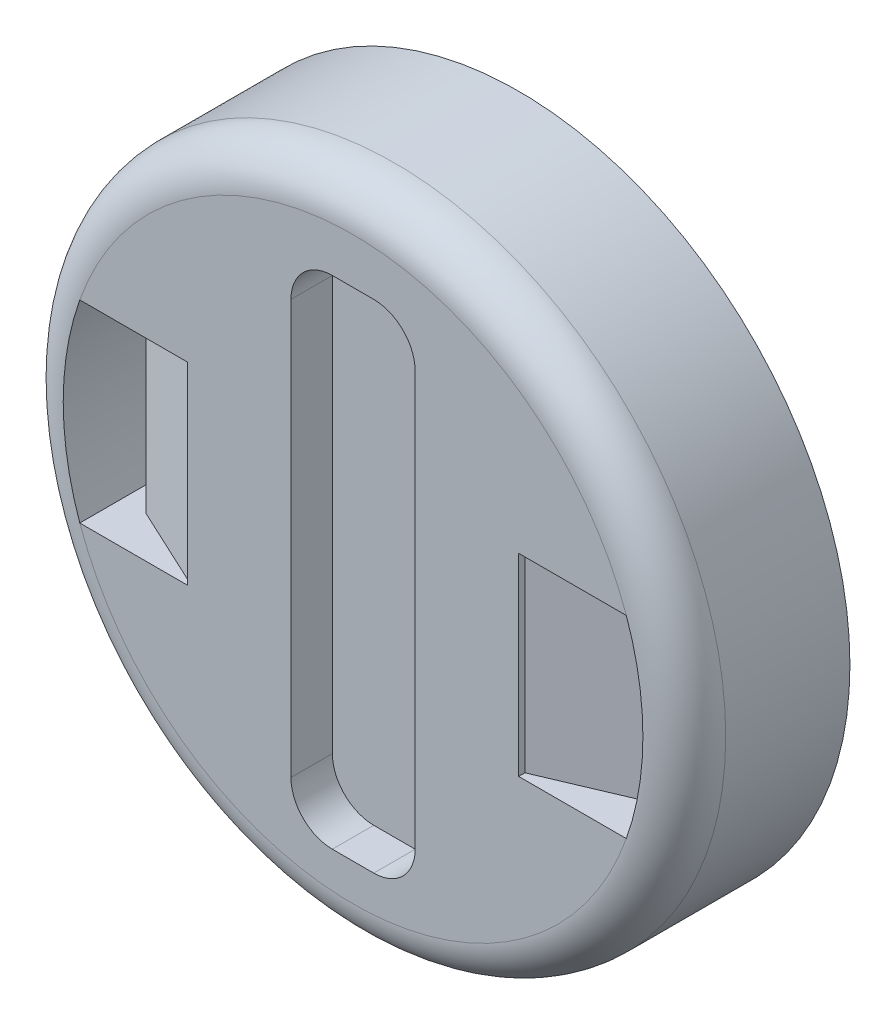
ISO-10303-21;
HEADER;
FILE_DESCRIPTION(('STEP AP214'),'2;1');
FILE_NAME('part.step','',(''),(''),'','','');
FILE_SCHEMA(('AUTOMOTIVE_DESIGN { 1 0 10303 214 1 1 1 1 }'));
ENDSEC;
DATA;
#1=APPLICATION_CONTEXT('core data for automotive mechanical design processes');
#2=APPLICATION_PROTOCOL_DEFINITION('international standard','automotive_design',2000,#1);
#3=PRODUCT_CONTEXT('',#1,'mechanical');
#4=PRODUCT('Part','Part','',(#3));
#5=PRODUCT_RELATED_PRODUCT_CATEGORY('part','',(#4));
#6=PRODUCT_DEFINITION_FORMATION('','',#4);
#7=PRODUCT_DEFINITION_CONTEXT('part definition',#1,'design');
#8=PRODUCT_DEFINITION('design','',#6,#7);
#9=PRODUCT_DEFINITION_SHAPE('','',#8);
#10=(LENGTH_UNIT() NAMED_UNIT(*) SI_UNIT(.MILLI.,.METRE.));
#11=(NAMED_UNIT(*) PLANE_ANGLE_UNIT() SI_UNIT($,.RADIAN.));
#12=(NAMED_UNIT(*) SI_UNIT($,.STERADIAN.) SOLID_ANGLE_UNIT());
#13=UNCERTAINTY_MEASURE_WITH_UNIT(LENGTH_MEASURE(1.E-05),#10,'distance_accuracy_value','');
#14=(GEOMETRIC_REPRESENTATION_CONTEXT(3) GLOBAL_UNCERTAINTY_ASSIGNED_CONTEXT((#13)) GLOBAL_UNIT_ASSIGNED_CONTEXT((#10,
#11,#12)) REPRESENTATION_CONTEXT('',''));
#15=CARTESIAN_POINT('',(0.,0.,0.));
#16=DIRECTION('',(0.,0.,1.));
#17=DIRECTION('',(1.,0.,0.));
#18=AXIS2_PLACEMENT_3D('',#15,#16,#17);
#19=CARTESIAN_POINT('',(4.,2.33333333333333,15.));
#20=DIRECTION('',(0.,1.,0.));
#21=DIRECTION('',(0.,0.,1.));
#22=AXIS2_PLACEMENT_3D('',#19,#20,#21);
#23=PLANE('',#22);
#24=DIRECTION('',(-1.,0.,0.));
#25=VECTOR('',#24,1.);
#26=CARTESIAN_POINT('',(4.,2.33333333333333,14.));
#27=LINE('',#26,#25);
#28=CARTESIAN_POINT('',(6.59966329107444,2.33333333333333,14.));
#29=VERTEX_POINT('',#28);
#30=CARTESIAN_POINT('',(5.99999999999999,2.33333333333333,14.));
#31=VERTEX_POINT('',#30);
#32=EDGE_CURVE('E437',#29,#31,#27,.T.);
#33=ORIENTED_EDGE('',*,*,#32,.F.);
#34=DIRECTION('',(0.,0.,1.));
#35=VECTOR('',#34,1.);
#36=CARTESIAN_POINT('',(6.59966329107444,2.33333333333333,15.));
#37=LINE('',#36,#35);
#38=CARTESIAN_POINT('',(6.59966329107444,2.33333333333333,16.));
#39=VERTEX_POINT('',#38);
#40=EDGE_CURVE('E187',#29,#39,#37,.T.);
#41=ORIENTED_EDGE('',*,*,#40,.T.);
#42=DIRECTION('',(-1.,0.,0.));
#43=VECTOR('',#42,1.);
#44=CARTESIAN_POINT('',(4.,2.33333333333333,16.));
#45=LINE('',#44,#43);
#46=CARTESIAN_POINT('',(4.,2.33333333333333,16.));
#47=VERTEX_POINT('',#46);
#48=EDGE_CURVE('E212',#39,#47,#45,.T.);
#49=ORIENTED_EDGE('',*,*,#48,.T.);
#50=DIRECTION('',(0.,0.,1.));
#51=VECTOR('',#50,1.);
#52=CARTESIAN_POINT('',(4.,2.33333333333333,15.));
#53=LINE('',#52,#51);
#54=CARTESIAN_POINT('',(4.,2.33333333333333,15.8489496324192));
#55=VERTEX_POINT('',#54);
#56=EDGE_CURVE('E216',#55,#47,#53,.T.);
#57=ORIENTED_EDGE('',*,*,#56,.F.);
#58=DIRECTION('',(0.920504853452438,0.,-0.390731128489278));
#59=VECTOR('',#58,1.);
#60=CARTESIAN_POINT('',(5.99999999999999,2.33333333333333,15.));
#61=LINE('',#60,#59);
#62=CARTESIAN_POINT('',(5.99999999999999,2.33333333333333,15.));
#63=VERTEX_POINT('',#62);
#64=EDGE_CURVE('E309',#55,#63,#61,.T.);
#65=ORIENTED_EDGE('',*,*,#64,.T.);
#66=DIRECTION('',(0.,0.,1.));
#67=VECTOR('',#66,1.);
#68=CARTESIAN_POINT('',(5.99999999999999,2.33333333333333,7.));
#69=LINE('',#68,#67);
#70=EDGE_CURVE('E418',#31,#63,#69,.T.);
#71=ORIENTED_EDGE('',*,*,#70,.F.);
#72=EDGE_LOOP('',(#33,#41,#49,#57,#65,#71));
#73=FACE_BOUND('',#72,.T.);
#74=ADVANCED_FACE('F34',(#73),#23,.F.);
#75=CARTESIAN_POINT('',(4.,-2.33333333333333,15.));
#76=DIRECTION('',(0.,-1.,0.));
#77=DIRECTION('',(0.,0.,-1.));
#78=AXIS2_PLACEMENT_3D('',#75,#76,#77);
#79=PLANE('',#78);
#80=DIRECTION('',(1.,0.,0.));
#81=VECTOR('',#80,1.);
#82=CARTESIAN_POINT('',(4.,-2.33333333333333,14.));
#83=LINE('',#82,#81);
#84=CARTESIAN_POINT('',(5.99999999999999,-2.33333333333333,14.));
#85=VERTEX_POINT('',#84);
#86=CARTESIAN_POINT('',(6.59966329107444,-2.33333333333333,14.));
#87=VERTEX_POINT('',#86);
#88=EDGE_CURVE('E447',#85,#87,#83,.T.);
#89=ORIENTED_EDGE('',*,*,#88,.F.);
#90=DIRECTION('',(0.,0.,1.));
#91=VECTOR('',#90,1.);
#92=CARTESIAN_POINT('',(5.99999999999999,-2.33333333333333,7.));
#93=LINE('',#92,#91);
#94=CARTESIAN_POINT('',(5.99999999999999,-2.33333333333333,15.));
#95=VERTEX_POINT('',#94);
#96=EDGE_CURVE('E445',#85,#95,#93,.T.);
#97=ORIENTED_EDGE('',*,*,#96,.T.);
#98=DIRECTION('',(-0.920504853452438,0.,0.390731128489278));
#99=VECTOR('',#98,1.);
#100=CARTESIAN_POINT('',(5.99999999999999,-2.33333333333333,15.));
#101=LINE('',#100,#99);
#102=CARTESIAN_POINT('',(4.,-2.33333333333333,15.8489496324192));
#103=VERTEX_POINT('',#102);
#104=EDGE_CURVE('E306',#95,#103,#101,.T.);
#105=ORIENTED_EDGE('',*,*,#104,.T.);
#106=DIRECTION('',(0.,0.,1.));
#107=VECTOR('',#106,1.);
#108=CARTESIAN_POINT('',(4.,-2.33333333333333,15.));
#109=LINE('',#108,#107);
#110=CARTESIAN_POINT('',(4.,-2.33333333333333,16.));
#111=VERTEX_POINT('',#110);
#112=EDGE_CURVE('E215',#103,#111,#109,.T.);
#113=ORIENTED_EDGE('',*,*,#112,.T.);
#114=DIRECTION('',(1.,0.,0.));
#115=VECTOR('',#114,1.);
#116=CARTESIAN_POINT('',(4.,-2.33333333333333,16.));
#117=LINE('',#116,#115);
#118=CARTESIAN_POINT('',(6.59966329107444,-2.33333333333333,16.));
#119=VERTEX_POINT('',#118);
#120=EDGE_CURVE('E206',#111,#119,#117,.T.);
#121=ORIENTED_EDGE('',*,*,#120,.T.);
#122=DIRECTION('',(0.,0.,1.));
#123=VECTOR('',#122,1.);
#124=CARTESIAN_POINT('',(6.59966329107444,-2.33333333333333,15.));
#125=LINE('',#124,#123);
#126=EDGE_CURVE('E220',#87,#119,#125,.T.);
#127=ORIENTED_EDGE('',*,*,#126,.F.);
#128=EDGE_LOOP('',(#89,#97,#105,#113,#121,#127));
#129=FACE_BOUND('',#128,.T.);
#130=ADVANCED_FACE('F338',(#129),#79,.F.);
#131=CARTESIAN_POINT('',(-6.59966329107444,-2.33333333333333,15.));
#132=DIRECTION('',(0.,-1.,0.));
#133=DIRECTION('',(1.,0.,0.));
#134=AXIS2_PLACEMENT_3D('',#131,#132,#133);
#135=PLANE('',#134);
#136=DIRECTION('',(1.,0.,0.));
#137=VECTOR('',#136,1.);
#138=CARTESIAN_POINT('',(-6.59966329107444,-2.33333333333333,14.));
#139=LINE('',#138,#137);
#140=CARTESIAN_POINT('',(-6.59966329107444,-2.33333333333333,14.));
#141=VERTEX_POINT('',#140);
#142=CARTESIAN_POINT('',(-5.99999999999999,-2.33333333333333,14.));
#143=VERTEX_POINT('',#142);
#144=EDGE_CURVE('E49',#141,#143,#139,.T.);
#145=ORIENTED_EDGE('',*,*,#144,.F.);
#146=DIRECTION('',(0.,0.,1.));
#147=VECTOR('',#146,1.);
#148=CARTESIAN_POINT('',(-6.59966329107444,-2.33333333333333,15.));
#149=LINE('',#148,#147);
#150=CARTESIAN_POINT('',(-6.59966329107444,-2.33333333333333,16.));
#151=VERTEX_POINT('',#150);
#152=EDGE_CURVE('E194',#141,#151,#149,.T.);
#153=ORIENTED_EDGE('',*,*,#152,.T.);
#154=DIRECTION('',(1.,0.,0.));
#155=VECTOR('',#154,1.);
#156=CARTESIAN_POINT('',(-6.59966329107444,-2.33333333333333,16.));
#157=LINE('',#156,#155);
#158=CARTESIAN_POINT('',(-4.,-2.33333333333333,16.));
#159=VERTEX_POINT('',#158);
#160=EDGE_CURVE('E199',#151,#159,#157,.T.);
#161=ORIENTED_EDGE('',*,*,#160,.T.);
#162=DIRECTION('',(0.,0.,1.));
#163=VECTOR('',#162,1.);
#164=CARTESIAN_POINT('',(-4.,-2.33333333333333,15.));
#165=LINE('',#164,#163);
#166=CARTESIAN_POINT('',(-4.,-2.33333333333333,15.93261531631));
#167=VERTEX_POINT('',#166);
#168=EDGE_CURVE('E197',#167,#159,#165,.T.);
#169=ORIENTED_EDGE('',*,*,#168,.F.);
#170=DIRECTION('',(-0.906307787036648,0.,-0.422618261740703));
#171=VECTOR('',#170,1.);
#172=CARTESIAN_POINT('',(-5.99999999999999,-2.33333333333333,15.));
#173=LINE('',#172,#171);
#174=CARTESIAN_POINT('',(-5.99999999999999,-2.33333333333333,15.));
#175=VERTEX_POINT('',#174);
#176=EDGE_CURVE('E300',#167,#175,#173,.T.);
#177=ORIENTED_EDGE('',*,*,#176,.T.);
#178=DIRECTION('',(0.,0.,1.));
#179=VECTOR('',#178,1.);
#180=CARTESIAN_POINT('',(-5.99999999999999,-2.33333333333333,7.));
#181=LINE('',#180,#179);
#182=EDGE_CURVE('E446',#143,#175,#181,.T.);
#183=ORIENTED_EDGE('',*,*,#182,.F.);
#184=EDGE_LOOP('',(#145,#153,#161,#169,#177,#183));
#185=FACE_BOUND('',#184,.T.);
#186=ADVANCED_FACE('F344',(#185),#135,.F.);
#187=CARTESIAN_POINT('',(-6.59966329107444,2.33333333333333,15.));
#188=DIRECTION('',(0.,1.,0.));
#189=DIRECTION('',(0.,0.,1.));
#190=AXIS2_PLACEMENT_3D('',#187,#188,#189);
#191=PLANE('',#190);
#192=DIRECTION('',(-1.,0.,0.));
#193=VECTOR('',#192,1.);
#194=CARTESIAN_POINT('',(-6.59966329107444,2.33333333333333,14.));
#195=LINE('',#194,#193);
#196=CARTESIAN_POINT('',(-5.99999999999999,2.33333333333333,14.));
#197=VERTEX_POINT('',#196);
#198=CARTESIAN_POINT('',(-6.59966329107444,2.33333333333333,14.));
#199=VERTEX_POINT('',#198);
#200=EDGE_CURVE('E170',#197,#199,#195,.T.);
#201=ORIENTED_EDGE('',*,*,#200,.F.);
#202=DIRECTION('',(0.,0.,1.));
#203=VECTOR('',#202,1.);
#204=CARTESIAN_POINT('',(-5.99999999999999,2.33333333333333,7.));
#205=LINE('',#204,#203);
#206=CARTESIAN_POINT('',(-5.99999999999999,2.33333333333333,15.));
#207=VERTEX_POINT('',#206);
#208=EDGE_CURVE('E207',#197,#207,#205,.T.);
#209=ORIENTED_EDGE('',*,*,#208,.T.);
#210=DIRECTION('',(0.906307787036648,0.,0.422618261740703));
#211=VECTOR('',#210,1.);
#212=CARTESIAN_POINT('',(-5.99999999999999,2.33333333333333,15.));
#213=LINE('',#212,#211);
#214=CARTESIAN_POINT('',(-4.,2.33333333333333,15.93261531631));
#215=VERTEX_POINT('',#214);
#216=EDGE_CURVE('E296',#207,#215,#213,.T.);
#217=ORIENTED_EDGE('',*,*,#216,.T.);
#218=DIRECTION('',(0.,0.,1.));
#219=VECTOR('',#218,1.);
#220=CARTESIAN_POINT('',(-4.,2.33333333333333,15.));
#221=LINE('',#220,#219);
#222=CARTESIAN_POINT('',(-4.,2.33333333333333,16.));
#223=VERTEX_POINT('',#222);
#224=EDGE_CURVE('E195',#215,#223,#221,.T.);
#225=ORIENTED_EDGE('',*,*,#224,.T.);
#226=DIRECTION('',(-1.,0.,0.));
#227=VECTOR('',#226,1.);
#228=CARTESIAN_POINT('',(-6.59966329107444,2.33333333333333,16.));
#229=LINE('',#228,#227);
#230=CARTESIAN_POINT('',(-6.59966329107444,2.33333333333333,16.));
#231=VERTEX_POINT('',#230);
#232=EDGE_CURVE('E192',#223,#231,#229,.T.);
#233=ORIENTED_EDGE('',*,*,#232,.T.);
#234=DIRECTION('',(0.,0.,1.));
#235=VECTOR('',#234,1.);
#236=CARTESIAN_POINT('',(-6.59966329107444,2.33333333333333,15.));
#237=LINE('',#236,#235);
#238=EDGE_CURVE('E184',#199,#231,#237,.T.);
#239=ORIENTED_EDGE('',*,*,#238,.F.);
#240=EDGE_LOOP('',(#201,#209,#217,#225,#233,#239));
#241=FACE_BOUND('',#240,.T.);
#242=ADVANCED_FACE('F190',(#241),#191,.F.);
#243=CARTESIAN_POINT('',(5.99999999999999,2.33333333333333,7.));
#244=DIRECTION('',(-1.,0.,0.));
#245=DIRECTION('',(0.,0.,1.));
#246=AXIS2_PLACEMENT_3D('',#243,#244,#245);
#247=PLANE('',#246);
#248=DIRECTION('',(0.,-1.,0.));
#249=VECTOR('',#248,1.);
#250=CARTESIAN_POINT('',(5.99999999999999,2.33333333333333,14.));
#251=LINE('',#250,#249);
#252=EDGE_CURVE('E449',#31,#85,#251,.T.);
#253=ORIENTED_EDGE('',*,*,#252,.F.);
#254=ORIENTED_EDGE('',*,*,#70,.T.);
#255=DIRECTION('',(0.,-1.,0.));
#256=VECTOR('',#255,1.);
#257=CARTESIAN_POINT('',(5.99999999999999,0.,15.));
#258=LINE('',#257,#256);
#259=EDGE_CURVE('E303',#63,#95,#258,.T.);
#260=ORIENTED_EDGE('',*,*,#259,.T.);
#261=ORIENTED_EDGE('',*,*,#96,.F.);
#262=EDGE_LOOP('',(#253,#254,#260,#261));
#263=FACE_BOUND('',#262,.T.);
#264=ADVANCED_FACE('F333',(#263),#247,.F.);
#265=CARTESIAN_POINT('',(-5.99999999999999,-2.33333333333333,7.));
#266=DIRECTION('',(1.,0.,0.));
#267=DIRECTION('',(0.,0.,-1.));
#268=AXIS2_PLACEMENT_3D('',#265,#266,#267);
#269=PLANE('',#268);
#270=DIRECTION('',(0.,1.,0.));
#271=VECTOR('',#270,1.);
#272=CARTESIAN_POINT('',(-5.99999999999999,-2.33333333333333,14.));
#273=LINE('',#272,#271);
#274=EDGE_CURVE('E11',#143,#197,#273,.T.);
#275=ORIENTED_EDGE('',*,*,#274,.F.);
#276=ORIENTED_EDGE('',*,*,#182,.T.);
#277=DIRECTION('',(0.,1.,0.));
#278=VECTOR('',#277,1.);
#279=CARTESIAN_POINT('',(-5.99999999999999,0.,15.));
#280=LINE('',#279,#278);
#281=EDGE_CURVE('E293',#175,#207,#280,.T.);
#282=ORIENTED_EDGE('',*,*,#281,.T.);
#283=ORIENTED_EDGE('',*,*,#208,.F.);
#284=EDGE_LOOP('',(#275,#276,#282,#283));
#285=FACE_BOUND('',#284,.T.);
#286=ADVANCED_FACE('F324',(#285),#269,.F.);
#287=CARTESIAN_POINT('',(0.,0.,16.));
#288=DIRECTION('',(0.,0.,-1.));
#289=DIRECTION('',(-1.,0.,0.));
#290=AXIS2_PLACEMENT_3D('',#287,#288,#289);
#291=CYLINDRICAL_SURFACE('',#290,8.);
#292=CARTESIAN_POINT('',(0.,0.,15.));
#293=DIRECTION('',(0.,0.,-1.));
#294=DIRECTION('',(-1.,0.,0.));
#295=AXIS2_PLACEMENT_3D('',#292,#293,#294);
#296=CIRCLE('',#295,8.);
#297=CARTESIAN_POINT('',(-8.,0.,15.));
#298=VERTEX_POINT('',#297);
#299=EDGE_CURVE('E250',#298,#298,#296,.T.);
#300=ORIENTED_EDGE('',*,*,#299,.T.);
#301=EDGE_LOOP('',(#300));
#302=FACE_BOUND('',#301,.T.);
#303=CARTESIAN_POINT('',(0.,0.,12.));
#304=DIRECTION('',(0.,0.,-1.));
#305=DIRECTION('',(-1.,0.,0.));
#306=AXIS2_PLACEMENT_3D('',#303,#304,#305);
#307=CIRCLE('',#306,8.);
#308=CARTESIAN_POINT('',(-8.,0.,12.));
#309=VERTEX_POINT('',#308);
#310=EDGE_CURVE('E236',#309,#309,#307,.T.);
#311=ORIENTED_EDGE('',*,*,#310,.F.);
#312=EDGE_LOOP('',(#311));
#313=FACE_BOUND('',#312,.T.);
#314=ADVANCED_FACE('F322',(#302,#313),#291,.T.);
#315=CARTESIAN_POINT('',(0.,0.,16.));
#316=DIRECTION('',(0.,0.,-1.));
#317=DIRECTION('',(-1.,0.,0.));
#318=AXIS2_PLACEMENT_3D('',#315,#316,#317);
#319=PLANE('',#318);
#320=DIRECTION('',(1.,0.,0.));
#321=VECTOR('',#320,1.);
#322=CARTESIAN_POINT('',(-1.5,-6.10540648566572,16.));
#323=LINE('',#322,#321);
#324=CARTESIAN_POINT('',(-0.499999999999998,-6.10540648566572,16.));
#325=VERTEX_POINT('',#324);
#326=CARTESIAN_POINT('',(0.500000000000001,-6.10540648566572,16.));
#327=VERTEX_POINT('',#326);
#328=EDGE_CURVE('E240',#325,#327,#323,.T.);
#329=ORIENTED_EDGE('',*,*,#328,.F.);
#330=CARTESIAN_POINT('',(-0.499999999999998,-5.10540648566572,16.));
#331=DIRECTION('',(0.,0.,-1.));
#332=DIRECTION('',(-1.,0.,0.));
#333=AXIS2_PLACEMENT_3D('',#330,#331,#332);
#334=CIRCLE('',#333,1.);
#335=CARTESIAN_POINT('',(-1.5,-5.10540648566572,16.));
#336=VERTEX_POINT('',#335);
#337=EDGE_CURVE('E287',#325,#336,#334,.T.);
#338=ORIENTED_EDGE('',*,*,#337,.T.);
#339=DIRECTION('',(0.,-1.,0.));
#340=VECTOR('',#339,1.);
#341=CARTESIAN_POINT('',(-1.5,5.89459351433428,16.));
#342=LINE('',#341,#340);
#343=CARTESIAN_POINT('',(-1.5,4.89459351433428,16.));
#344=VERTEX_POINT('',#343);
#345=EDGE_CURVE('E237',#344,#336,#342,.T.);
#346=ORIENTED_EDGE('',*,*,#345,.F.);
#347=CARTESIAN_POINT('',(-0.5,4.89459351433428,16.));
#348=DIRECTION('',(0.,0.,-1.));
#349=DIRECTION('',(-1.,0.,0.));
#350=AXIS2_PLACEMENT_3D('',#347,#348,#349);
#351=CIRCLE('',#350,1.);
#352=CARTESIAN_POINT('',(-0.5,5.89459351433428,16.));
#353=VERTEX_POINT('',#352);
#354=EDGE_CURVE('E291',#344,#353,#351,.T.);
#355=ORIENTED_EDGE('',*,*,#354,.T.);
#356=DIRECTION('',(-1.,0.,0.));
#357=VECTOR('',#356,1.);
#358=CARTESIAN_POINT('',(-1.5,5.89459351433428,16.));
#359=LINE('',#358,#357);
#360=CARTESIAN_POINT('',(0.5,5.89459351433428,16.));
#361=VERTEX_POINT('',#360);
#362=EDGE_CURVE('E227',#361,#353,#359,.T.);
#363=ORIENTED_EDGE('',*,*,#362,.F.);
#364=CARTESIAN_POINT('',(0.5,4.89459351433428,16.));
#365=DIRECTION('',(0.,0.,-1.));
#366=DIRECTION('',(-1.,0.,0.));
#367=AXIS2_PLACEMENT_3D('',#364,#365,#366);
#368=CIRCLE('',#367,1.);
#369=CARTESIAN_POINT('',(1.5,4.89459351433428,16.));
#370=VERTEX_POINT('',#369);
#371=EDGE_CURVE('E289',#361,#370,#368,.T.);
#372=ORIENTED_EDGE('',*,*,#371,.T.);
#373=DIRECTION('',(0.,1.,0.));
#374=VECTOR('',#373,1.);
#375=CARTESIAN_POINT('',(1.5,5.89459351433428,16.));
#376=LINE('',#375,#374);
#377=CARTESIAN_POINT('',(1.5,-5.10540648566572,16.));
#378=VERTEX_POINT('',#377);
#379=EDGE_CURVE('E243',#378,#370,#376,.T.);
#380=ORIENTED_EDGE('',*,*,#379,.F.);
#381=CARTESIAN_POINT('',(0.500000000000001,-5.10540648566572,16.));
#382=DIRECTION('',(0.,0.,-1.));
#383=DIRECTION('',(-1.,0.,0.));
#384=AXIS2_PLACEMENT_3D('',#381,#382,#383);
#385=CIRCLE('',#384,1.);
#386=EDGE_CURVE('E285',#378,#327,#385,.T.);
#387=ORIENTED_EDGE('',*,*,#386,.T.);
#388=EDGE_LOOP('',(#329,#338,#346,#355,#363,#372,#380,#387));
#389=FACE_BOUND('',#388,.T.);
#390=DIRECTION('',(0.,1.,0.));
#391=VECTOR('',#390,1.);
#392=CARTESIAN_POINT('',(-4.,2.33333333333333,16.));
#393=LINE('',#392,#391);
#394=EDGE_CURVE('E218',#159,#223,#393,.T.);
#395=ORIENTED_EDGE('',*,*,#394,.F.);
#396=ORIENTED_EDGE('',*,*,#160,.F.);
#397=CARTESIAN_POINT('',(0.,0.,16.));
#398=DIRECTION('',(0.,0.,-1.));
#399=DIRECTION('',(-1.,0.,0.));
#400=AXIS2_PLACEMENT_3D('',#397,#398,#399);
#401=CIRCLE('',#400,7.);
#402=EDGE_CURVE('E254',#151,#119,#401,.F.);
#403=ORIENTED_EDGE('',*,*,#402,.T.);
#404=ORIENTED_EDGE('',*,*,#120,.F.);
#405=DIRECTION('',(0.,-1.,0.));
#406=VECTOR('',#405,1.);
#407=CARTESIAN_POINT('',(4.,2.33333333333333,16.));
#408=LINE('',#407,#406);
#409=EDGE_CURVE('E203',#47,#111,#408,.T.);
#410=ORIENTED_EDGE('',*,*,#409,.F.);
#411=ORIENTED_EDGE('',*,*,#48,.F.);
#412=EDGE_CURVE('E253',#39,#231,#401,.F.);
#413=ORIENTED_EDGE('',*,*,#412,.T.);
#414=ORIENTED_EDGE('',*,*,#232,.F.);
#415=EDGE_LOOP('',(#395,#396,#403,#404,#410,#411,#413,#414));
#416=FACE_BOUND('',#415,.T.);
#417=ADVANCED_FACE('F318',(#389,#416),#319,.F.);
#418=CARTESIAN_POINT('',(0.,0.,12.));
#419=DIRECTION('',(0.,0.,-1.));
#420=DIRECTION('',(-1.,0.,0.));
#421=AXIS2_PLACEMENT_3D('',#418,#419,#420);
#422=PLANE('',#421);
#423=CARTESIAN_POINT('',(0.,0.,12.));
#424=DIRECTION('',(0.,0.,-1.));
#425=DIRECTION('',(-1.,0.,0.));
#426=AXIS2_PLACEMENT_3D('',#423,#424,#425);
#427=CIRCLE('',#426,7.);
#428=CARTESIAN_POINT('',(-7.,0.,12.));
#429=VERTEX_POINT('',#428);
#430=EDGE_CURVE('E43',#429,#429,#427,.T.);
#431=ORIENTED_EDGE('',*,*,#430,.F.);
#432=EDGE_LOOP('',(#431));
#433=FACE_BOUND('',#432,.T.);
#434=ORIENTED_EDGE('',*,*,#310,.T.);
#435=EDGE_LOOP('',(#434));
#436=FACE_BOUND('',#435,.T.);
#437=ADVANCED_FACE('F314',(#433,#436),#422,.T.);
#438=CARTESIAN_POINT('',(0.,0.,15.));
#439=DIRECTION('',(0.,0.,-1.));
#440=DIRECTION('',(-1.,0.,0.));
#441=AXIS2_PLACEMENT_3D('',#438,#439,#440);
#442=TOROIDAL_SURFACE('',#441,7.,1.);
#443=ORIENTED_EDGE('',*,*,#402,.F.);
#444=CARTESIAN_POINT('',(0.,0.,16.));
#445=DIRECTION('',(0.,0.,1.));
#446=DIRECTION('',(1.,0.,0.));
#447=AXIS2_PLACEMENT_3D('',#444,#445,#446);
#448=CIRCLE('',#447,7.);
#449=EDGE_CURVE('E415',#231,#151,#448,.T.);
#450=ORIENTED_EDGE('',*,*,#449,.F.);
#451=ORIENTED_EDGE('',*,*,#412,.F.);
#452=CARTESIAN_POINT('',(0.,0.,16.));
#453=DIRECTION('',(0.,0.,1.));
#454=DIRECTION('',(1.,0.,0.));
#455=AXIS2_PLACEMENT_3D('',#452,#453,#454);
#456=CIRCLE('',#455,7.);
#457=EDGE_CURVE('E210',#119,#39,#456,.T.);
#458=ORIENTED_EDGE('',*,*,#457,.F.);
#459=EDGE_LOOP('',(#443,#450,#451,#458));
#460=FACE_BOUND('',#459,.T.);
#461=ORIENTED_EDGE('',*,*,#299,.F.);
#462=EDGE_LOOP('',(#461));
#463=FACE_BOUND('',#462,.T.);
#464=ADVANCED_FACE('F317',(#460,#463),#442,.T.);
#465=CARTESIAN_POINT('',(-1.5,5.89459351433428,15.));
#466=DIRECTION('',(-1.,0.,0.));
#467=DIRECTION('',(0.,-1.,0.));
#468=AXIS2_PLACEMENT_3D('',#465,#466,#467);
#469=PLANE('',#468);
#470=ORIENTED_EDGE('',*,*,#345,.T.);
#471=DIRECTION('',(0.,0.,1.));
#472=VECTOR('',#471,1.);
#473=CARTESIAN_POINT('',(-1.5,-5.10540648566572,15.));
#474=LINE('',#473,#472);
#475=CARTESIAN_POINT('',(-1.5,-5.10540648566572,15.));
#476=VERTEX_POINT('',#475);
#477=EDGE_CURVE('E278',#336,#476,#474,.F.);
#478=ORIENTED_EDGE('',*,*,#477,.T.);
#479=DIRECTION('',(0.,-1.,0.));
#480=VECTOR('',#479,1.);
#481=CARTESIAN_POINT('',(-1.5,5.89459351433428,15.));
#482=LINE('',#481,#480);
#483=CARTESIAN_POINT('',(-1.5,4.89459351433428,15.));
#484=VERTEX_POINT('',#483);
#485=EDGE_CURVE('E223',#484,#476,#482,.T.);
#486=ORIENTED_EDGE('',*,*,#485,.F.);
#487=DIRECTION('',(0.,0.,1.));
#488=VECTOR('',#487,1.);
#489=CARTESIAN_POINT('',(-1.5,4.89459351433428,16.));
#490=LINE('',#489,#488);
#491=EDGE_CURVE('E275',#484,#344,#490,.T.);
#492=ORIENTED_EDGE('',*,*,#491,.T.);
#493=EDGE_LOOP('',(#470,#478,#486,#492));
#494=FACE_BOUND('',#493,.T.);
#495=ADVANCED_FACE('F365',(#494),#469,.F.);
#496=CARTESIAN_POINT('',(-1.5,5.89459351433428,15.));
#497=DIRECTION('',(0.,1.,0.));
#498=DIRECTION('',(0.,0.,1.));
#499=AXIS2_PLACEMENT_3D('',#496,#497,#498);
#500=PLANE('',#499);
#501=DIRECTION('',(-1.,0.,0.));
#502=VECTOR('',#501,1.);
#503=CARTESIAN_POINT('',(-1.5,5.89459351433428,15.));
#504=LINE('',#503,#502);
#505=CARTESIAN_POINT('',(0.5,5.89459351433428,15.));
#506=VERTEX_POINT('',#505);
#507=CARTESIAN_POINT('',(-0.5,5.89459351433428,15.));
#508=VERTEX_POINT('',#507);
#509=EDGE_CURVE('E233',#506,#508,#504,.T.);
#510=ORIENTED_EDGE('',*,*,#509,.F.);
#511=DIRECTION('',(0.,0.,1.));
#512=VECTOR('',#511,1.);
#513=CARTESIAN_POINT('',(0.5,5.89459351433428,16.));
#514=LINE('',#513,#512);
#515=EDGE_CURVE('E282',#506,#361,#514,.T.);
#516=ORIENTED_EDGE('',*,*,#515,.T.);
#517=ORIENTED_EDGE('',*,*,#362,.T.);
#518=DIRECTION('',(0.,0.,1.));
#519=VECTOR('',#518,1.);
#520=CARTESIAN_POINT('',(-0.5,5.89459351433428,15.));
#521=LINE('',#520,#519);
#522=EDGE_CURVE('E280',#353,#508,#521,.F.);
#523=ORIENTED_EDGE('',*,*,#522,.T.);
#524=EDGE_LOOP('',(#510,#516,#517,#523));
#525=FACE_BOUND('',#524,.T.);
#526=ADVANCED_FACE('F361',(#525),#500,.F.);
#527=CARTESIAN_POINT('',(1.5,5.89459351433428,15.));
#528=DIRECTION('',(1.,0.,0.));
#529=DIRECTION('',(0.,1.,0.));
#530=AXIS2_PLACEMENT_3D('',#527,#528,#529);
#531=PLANE('',#530);
#532=DIRECTION('',(0.,1.,0.));
#533=VECTOR('',#532,1.);
#534=CARTESIAN_POINT('',(1.5,5.89459351433428,15.));
#535=LINE('',#534,#533);
#536=CARTESIAN_POINT('',(1.5,-5.10540648566572,15.));
#537=VERTEX_POINT('',#536);
#538=CARTESIAN_POINT('',(1.5,4.89459351433428,15.));
#539=VERTEX_POINT('',#538);
#540=EDGE_CURVE('E230',#537,#539,#535,.T.);
#541=ORIENTED_EDGE('',*,*,#540,.F.);
#542=DIRECTION('',(0.,0.,1.));
#543=VECTOR('',#542,1.);
#544=CARTESIAN_POINT('',(1.5,-5.10540648566572,16.));
#545=LINE('',#544,#543);
#546=EDGE_CURVE('E259',#537,#378,#545,.T.);
#547=ORIENTED_EDGE('',*,*,#546,.T.);
#548=ORIENTED_EDGE('',*,*,#379,.T.);
#549=DIRECTION('',(0.,0.,1.));
#550=VECTOR('',#549,1.);
#551=CARTESIAN_POINT('',(1.5,4.89459351433428,15.));
#552=LINE('',#551,#550);
#553=EDGE_CURVE('E257',#370,#539,#552,.F.);
#554=ORIENTED_EDGE('',*,*,#553,.T.);
#555=EDGE_LOOP('',(#541,#547,#548,#554));
#556=FACE_BOUND('',#555,.T.);
#557=ADVANCED_FACE('F364',(#556),#531,.F.);
#558=CARTESIAN_POINT('',(-1.5,-6.10540648566572,15.));
#559=DIRECTION('',(0.,-1.,0.));
#560=DIRECTION('',(0.,0.,-1.));
#561=AXIS2_PLACEMENT_3D('',#558,#559,#560);
#562=PLANE('',#561);
#563=ORIENTED_EDGE('',*,*,#328,.T.);
#564=DIRECTION('',(0.,0.,1.));
#565=VECTOR('',#564,1.);
#566=CARTESIAN_POINT('',(0.500000000000001,-6.10540648566572,15.));
#567=LINE('',#566,#565);
#568=CARTESIAN_POINT('',(0.500000000000001,-6.10540648566572,15.));
#569=VERTEX_POINT('',#568);
#570=EDGE_CURVE('E265',#327,#569,#567,.F.);
#571=ORIENTED_EDGE('',*,*,#570,.T.);
#572=DIRECTION('',(1.,0.,0.));
#573=VECTOR('',#572,1.);
#574=CARTESIAN_POINT('',(-1.5,-6.10540648566572,15.));
#575=LINE('',#574,#573);
#576=CARTESIAN_POINT('',(-0.499999999999998,-6.10540648566572,15.));
#577=VERTEX_POINT('',#576);
#578=EDGE_CURVE('E226',#577,#569,#575,.T.);
#579=ORIENTED_EDGE('',*,*,#578,.F.);
#580=DIRECTION('',(0.,0.,1.));
#581=VECTOR('',#580,1.);
#582=CARTESIAN_POINT('',(-0.499999999999998,-6.10540648566572,16.));
#583=LINE('',#582,#581);
#584=EDGE_CURVE('E262',#577,#325,#583,.T.);
#585=ORIENTED_EDGE('',*,*,#584,.T.);
#586=EDGE_LOOP('',(#563,#571,#579,#585));
#587=FACE_BOUND('',#586,.T.);
#588=ADVANCED_FACE('F359',(#587),#562,.F.);
#589=CARTESIAN_POINT('',(0.,0.,15.));
#590=DIRECTION('',(0.,0.,1.));
#591=DIRECTION('',(1.,0.,0.));
#592=AXIS2_PLACEMENT_3D('',#589,#590,#591);
#593=PLANE('',#592);
#594=ORIENTED_EDGE('',*,*,#578,.T.);
#595=CARTESIAN_POINT('',(0.500000000000001,-5.10540648566572,15.));
#596=DIRECTION('',(0.,0.,1.));
#597=DIRECTION('',(1.,0.,0.));
#598=AXIS2_PLACEMENT_3D('',#595,#596,#597);
#599=CIRCLE('',#598,1.);
#600=EDGE_CURVE('E273',#569,#537,#599,.T.);
#601=ORIENTED_EDGE('',*,*,#600,.T.);
#602=ORIENTED_EDGE('',*,*,#540,.T.);
#603=CARTESIAN_POINT('',(0.5,4.89459351433428,15.));
#604=DIRECTION('',(0.,0.,1.));
#605=DIRECTION('',(1.,0.,0.));
#606=AXIS2_PLACEMENT_3D('',#603,#604,#605);
#607=CIRCLE('',#606,1.);
#608=EDGE_CURVE('E269',#539,#506,#607,.T.);
#609=ORIENTED_EDGE('',*,*,#608,.T.);
#610=ORIENTED_EDGE('',*,*,#509,.T.);
#611=CARTESIAN_POINT('',(-0.5,4.89459351433428,15.));
#612=DIRECTION('',(0.,0.,1.));
#613=DIRECTION('',(1.,0.,0.));
#614=AXIS2_PLACEMENT_3D('',#611,#612,#613);
#615=CIRCLE('',#614,1.);
#616=EDGE_CURVE('E267',#508,#484,#615,.T.);
#617=ORIENTED_EDGE('',*,*,#616,.T.);
#618=ORIENTED_EDGE('',*,*,#485,.T.);
#619=CARTESIAN_POINT('',(-0.499999999999998,-5.10540648566572,15.));
#620=DIRECTION('',(0.,0.,1.));
#621=DIRECTION('',(1.,0.,0.));
#622=AXIS2_PLACEMENT_3D('',#619,#620,#621);
#623=CIRCLE('',#622,1.);
#624=EDGE_CURVE('E271',#476,#577,#623,.T.);
#625=ORIENTED_EDGE('',*,*,#624,.T.);
#626=EDGE_LOOP('',(#594,#601,#602,#609,#610,#617,#618,#625));
#627=FACE_BOUND('',#626,.T.);
#628=ADVANCED_FACE('F355',(#627),#593,.T.);
#629=CARTESIAN_POINT('',(0.500000000000001,-5.10540648566572,15.));
#630=DIRECTION('',(0.,0.,-1.));
#631=DIRECTION('',(-1.,0.,0.));
#632=AXIS2_PLACEMENT_3D('',#629,#630,#631);
#633=CYLINDRICAL_SURFACE('',#632,1.);
#634=ORIENTED_EDGE('',*,*,#600,.F.);
#635=ORIENTED_EDGE('',*,*,#570,.F.);
#636=ORIENTED_EDGE('',*,*,#386,.F.);
#637=ORIENTED_EDGE('',*,*,#546,.F.);
#638=EDGE_LOOP('',(#634,#635,#636,#637));
#639=FACE_BOUND('',#638,.T.);
#640=ADVANCED_FACE('F358',(#639),#633,.F.);
#641=CARTESIAN_POINT('',(-0.499999999999998,-5.10540648566572,15.));
#642=DIRECTION('',(0.,0.,-1.));
#643=DIRECTION('',(-1.,0.,0.));
#644=AXIS2_PLACEMENT_3D('',#641,#642,#643);
#645=CYLINDRICAL_SURFACE('',#644,1.);
#646=ORIENTED_EDGE('',*,*,#624,.F.);
#647=ORIENTED_EDGE('',*,*,#477,.F.);
#648=ORIENTED_EDGE('',*,*,#337,.F.);
#649=ORIENTED_EDGE('',*,*,#584,.F.);
#650=EDGE_LOOP('',(#646,#647,#648,#649));
#651=FACE_BOUND('',#650,.T.);
#652=ADVANCED_FACE('F385',(#651),#645,.F.);
#653=CARTESIAN_POINT('',(0.5,4.89459351433428,15.));
#654=DIRECTION('',(0.,0.,-1.));
#655=DIRECTION('',(-1.,0.,0.));
#656=AXIS2_PLACEMENT_3D('',#653,#654,#655);
#657=CYLINDRICAL_SURFACE('',#656,1.);
#658=ORIENTED_EDGE('',*,*,#608,.F.);
#659=ORIENTED_EDGE('',*,*,#553,.F.);
#660=ORIENTED_EDGE('',*,*,#371,.F.);
#661=ORIENTED_EDGE('',*,*,#515,.F.);
#662=EDGE_LOOP('',(#658,#659,#660,#661));
#663=FACE_BOUND('',#662,.T.);
#664=ADVANCED_FACE('F398',(#663),#657,.F.);
#665=CARTESIAN_POINT('',(-0.5,4.89459351433428,15.));
#666=DIRECTION('',(0.,0.,-1.));
#667=DIRECTION('',(-1.,0.,0.));
#668=AXIS2_PLACEMENT_3D('',#665,#666,#667);
#669=CYLINDRICAL_SURFACE('',#668,1.);
#670=ORIENTED_EDGE('',*,*,#616,.F.);
#671=ORIENTED_EDGE('',*,*,#522,.F.);
#672=ORIENTED_EDGE('',*,*,#354,.F.);
#673=ORIENTED_EDGE('',*,*,#491,.F.);
#674=EDGE_LOOP('',(#670,#671,#672,#673));
#675=FACE_BOUND('',#674,.T.);
#676=ADVANCED_FACE('F354',(#675),#669,.F.);
#677=CARTESIAN_POINT('',(4.,2.33333333333333,15.));
#678=DIRECTION('',(-1.,0.,0.));
#679=DIRECTION('',(0.,0.,1.));
#680=AXIS2_PLACEMENT_3D('',#677,#678,#679);
#681=PLANE('',#680);
#682=ORIENTED_EDGE('',*,*,#112,.F.);
#683=DIRECTION('',(0.,1.,0.));
#684=VECTOR('',#683,1.);
#685=CARTESIAN_POINT('',(4.,2.33333333333333,15.8489496324192));
#686=LINE('',#685,#684);
#687=EDGE_CURVE('E57',#103,#55,#686,.T.);
#688=ORIENTED_EDGE('',*,*,#687,.T.);
#689=ORIENTED_EDGE('',*,*,#56,.T.);
#690=ORIENTED_EDGE('',*,*,#409,.T.);
#691=EDGE_LOOP('',(#682,#688,#689,#690));
#692=FACE_BOUND('',#691,.T.);
#693=ADVANCED_FACE('F351',(#692),#681,.F.);
#694=CARTESIAN_POINT('',(-4.,2.33333333333333,15.));
#695=DIRECTION('',(1.,0.,0.));
#696=DIRECTION('',(0.,0.,-1.));
#697=AXIS2_PLACEMENT_3D('',#694,#695,#696);
#698=PLANE('',#697);
#699=ORIENTED_EDGE('',*,*,#224,.F.);
#700=DIRECTION('',(0.,-1.,0.));
#701=VECTOR('',#700,1.);
#702=CARTESIAN_POINT('',(-4.,2.33333333333333,15.93261531631));
#703=LINE('',#702,#701);
#704=EDGE_CURVE('E298',#215,#167,#703,.T.);
#705=ORIENTED_EDGE('',*,*,#704,.T.);
#706=ORIENTED_EDGE('',*,*,#168,.T.);
#707=ORIENTED_EDGE('',*,*,#394,.T.);
#708=EDGE_LOOP('',(#699,#705,#706,#707));
#709=FACE_BOUND('',#708,.T.);
#710=ADVANCED_FACE('F348',(#709),#698,.F.);
#711=CARTESIAN_POINT('',(0.,0.,15.));
#712=DIRECTION('',(0.,0.,1.));
#713=DIRECTION('',(1.,0.,0.));
#714=AXIS2_PLACEMENT_3D('',#711,#712,#713);
#715=CYLINDRICAL_SURFACE('',#714,7.);
#716=ORIENTED_EDGE('',*,*,#40,.F.);
#717=CARTESIAN_POINT('',(0.,0.,14.));
#718=DIRECTION('',(0.,0.,-1.));
#719=DIRECTION('',(-1.,0.,0.));
#720=AXIS2_PLACEMENT_3D('',#717,#718,#719);
#721=CIRCLE('',#720,7.);
#722=EDGE_CURVE('E173',#199,#29,#721,.T.);
#723=ORIENTED_EDGE('',*,*,#722,.F.);
#724=ORIENTED_EDGE('',*,*,#238,.T.);
#725=ORIENTED_EDGE('',*,*,#449,.T.);
#726=ORIENTED_EDGE('',*,*,#152,.F.);
#727=EDGE_CURVE('E188',#87,#141,#721,.T.);
#728=ORIENTED_EDGE('',*,*,#727,.F.);
#729=ORIENTED_EDGE('',*,*,#126,.T.);
#730=ORIENTED_EDGE('',*,*,#457,.T.);
#731=EDGE_LOOP('',(#716,#723,#724,#725,#726,#728,#729,#730));
#732=FACE_BOUND('',#731,.T.);
#733=ORIENTED_EDGE('',*,*,#430,.T.);
#734=EDGE_LOOP('',(#733));
#735=FACE_BOUND('',#734,.T.);
#736=ADVANCED_FACE('F181',(#732,#735),#715,.F.);
#737=CARTESIAN_POINT('',(-5.99999999999999,0.,15.));
#738=DIRECTION('',(0.422618261740703,0.,-0.906307787036648));
#739=DIRECTION('',(0.,1.,0.));
#740=AXIS2_PLACEMENT_3D('',#737,#738,#739);
#741=PLANE('',#740);
#742=ORIENTED_EDGE('',*,*,#176,.F.);
#743=ORIENTED_EDGE('',*,*,#704,.F.);
#744=ORIENTED_EDGE('',*,*,#216,.F.);
#745=ORIENTED_EDGE('',*,*,#281,.F.);
#746=EDGE_LOOP('',(#742,#743,#744,#745));
#747=FACE_BOUND('',#746,.T.);
#748=ADVANCED_FACE('F457',(#747),#741,.F.);
#749=CARTESIAN_POINT('',(5.99999999999999,0.,15.));
#750=DIRECTION('',(-0.390731128489278,0.,-0.920504853452438));
#751=DIRECTION('',(0.,-1.,0.));
#752=AXIS2_PLACEMENT_3D('',#749,#750,#751);
#753=PLANE('',#752);
#754=ORIENTED_EDGE('',*,*,#64,.F.);
#755=ORIENTED_EDGE('',*,*,#687,.F.);
#756=ORIENTED_EDGE('',*,*,#104,.F.);
#757=ORIENTED_EDGE('',*,*,#259,.F.);
#758=EDGE_LOOP('',(#754,#755,#756,#757));
#759=FACE_BOUND('',#758,.T.);
#760=ADVANCED_FACE('F37',(#759),#753,.F.);
#761=CARTESIAN_POINT('',(0.,0.,14.));
#762=DIRECTION('',(0.,0.,-1.));
#763=DIRECTION('',(-1.,0.,0.));
#764=AXIS2_PLACEMENT_3D('',#761,#762,#763);
#765=PLANE('',#764);
#766=ORIENTED_EDGE('',*,*,#32,.T.);
#767=ORIENTED_EDGE('',*,*,#252,.T.);
#768=ORIENTED_EDGE('',*,*,#88,.T.);
#769=ORIENTED_EDGE('',*,*,#727,.T.);
#770=ORIENTED_EDGE('',*,*,#144,.T.);
#771=ORIENTED_EDGE('',*,*,#274,.T.);
#772=ORIENTED_EDGE('',*,*,#200,.T.);
#773=ORIENTED_EDGE('',*,*,#722,.T.);
#774=EDGE_LOOP('',(#766,#767,#768,#769,#770,#771,#772,#773));
#775=FACE_BOUND('',#774,.T.);
#776=ADVANCED_FACE('F172',(#775),#765,.T.);
#777=CLOSED_SHELL('',(#74,#130,#186,#242,#264,#286,#314,#417,#437,#464,#495,#526,#557,#588,#628,
#640,#652,#664,#676,#693,#710,#736,#748,#760,#776));
#778=MANIFOLD_SOLID_BREP('B2',#777);
#779=ADVANCED_BREP_SHAPE_REPRESENTATION('',(#18,#778),#14);
#780=SHAPE_DEFINITION_REPRESENTATION(#9,#779);
ENDSEC;
END-ISO-10303-21;
